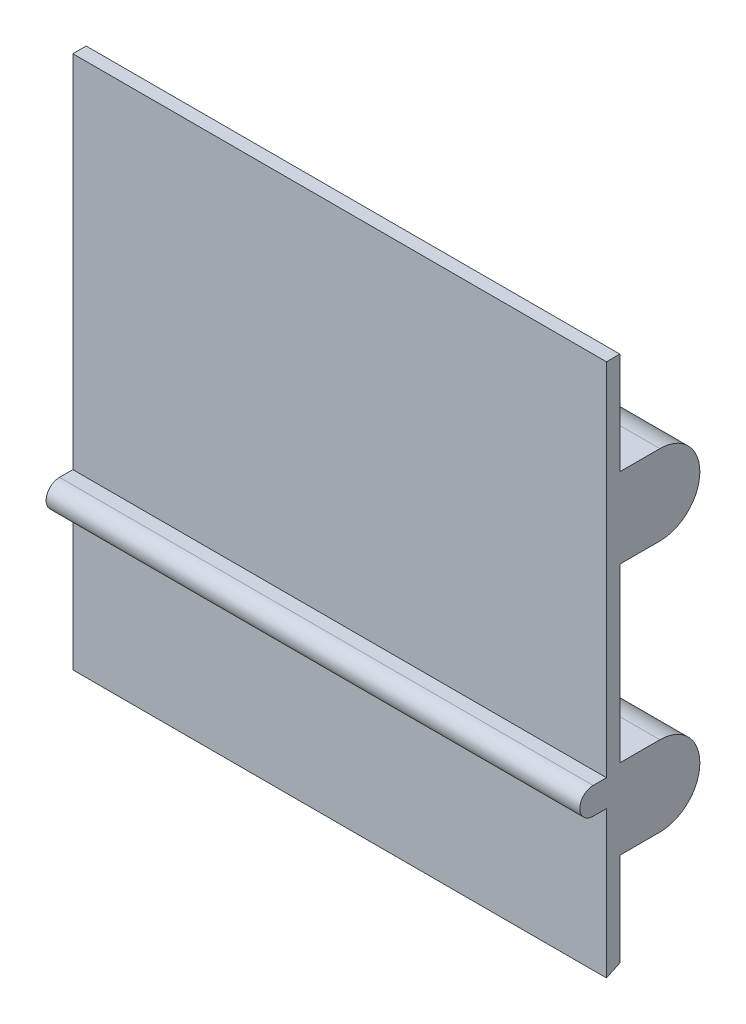
ISO-10303-21;
HEADER;
FILE_DESCRIPTION(('STEP AP214'),'2;1');
FILE_NAME('part.step','',(''),(''),'','','');
FILE_SCHEMA(('AUTOMOTIVE_DESIGN { 1 0 10303 214 1 1 1 1 }'));
ENDSEC;
DATA;
#1=APPLICATION_CONTEXT('core data for automotive mechanical design processes');
#2=APPLICATION_PROTOCOL_DEFINITION('international standard','automotive_design',2000,#1);
#3=PRODUCT_CONTEXT('',#1,'mechanical');
#4=PRODUCT('Part','Part','',(#3));
#5=PRODUCT_RELATED_PRODUCT_CATEGORY('part','',(#4));
#6=PRODUCT_DEFINITION_FORMATION('','',#4);
#7=PRODUCT_DEFINITION_CONTEXT('part definition',#1,'design');
#8=PRODUCT_DEFINITION('design','',#6,#7);
#9=PRODUCT_DEFINITION_SHAPE('','',#8);
#10=(LENGTH_UNIT() NAMED_UNIT(*) SI_UNIT(.MILLI.,.METRE.));
#11=(NAMED_UNIT(*) PLANE_ANGLE_UNIT() SI_UNIT($,.RADIAN.));
#12=(NAMED_UNIT(*) SI_UNIT($,.STERADIAN.) SOLID_ANGLE_UNIT());
#13=UNCERTAINTY_MEASURE_WITH_UNIT(LENGTH_MEASURE(1.E-05),#10,'distance_accuracy_value','');
#14=(GEOMETRIC_REPRESENTATION_CONTEXT(3) GLOBAL_UNCERTAINTY_ASSIGNED_CONTEXT((#13)) GLOBAL_UNIT_ASSIGNED_CONTEXT((#10,
#11,#12)) REPRESENTATION_CONTEXT('',''));
#15=CARTESIAN_POINT('',(0.,0.,0.));
#16=DIRECTION('',(0.,0.,1.));
#17=DIRECTION('',(1.,0.,0.));
#18=AXIS2_PLACEMENT_3D('',#15,#16,#17);
#19=CARTESIAN_POINT('',(0.,0.,3.175));
#20=DIRECTION('',(0.,0.,1.));
#21=DIRECTION('',(1.,0.,0.));
#22=AXIS2_PLACEMENT_3D('',#19,#20,#21);
#23=PLANE('',#22);
#24=DIRECTION('',(0.,-1.,0.));
#25=VECTOR('',#24,1.);
#26=CARTESIAN_POINT('',(-63.5000000000001,63.5,3.175));
#27=LINE('',#26,#25);
#28=CARTESIAN_POINT('',(-63.5000000000001,63.5,3.175));
#29=VERTEX_POINT('',#28);
#30=CARTESIAN_POINT('',(-63.5000000000001,-22.225,3.175));
#31=VERTEX_POINT('',#30);
#32=EDGE_CURVE('E64',#29,#31,#27,.T.);
#33=ORIENTED_EDGE('',*,*,#32,.T.);
#34=DIRECTION('',(1.,0.,0.));
#35=VECTOR('',#34,1.);
#36=CARTESIAN_POINT('',(-72.4802561210693,-22.225,3.175));
#37=LINE('',#36,#35);
#38=CARTESIAN_POINT('',(63.4999999999999,-22.225,3.175));
#39=VERTEX_POINT('',#38);
#40=EDGE_CURVE('E183',#31,#39,#37,.T.);
#41=ORIENTED_EDGE('',*,*,#40,.T.);
#42=DIRECTION('',(0.,1.,0.));
#43=VECTOR('',#42,1.);
#44=CARTESIAN_POINT('',(63.4999999999999,63.5,3.175));
#45=LINE('',#44,#43);
#46=CARTESIAN_POINT('',(63.4999999999999,63.5,3.175));
#47=VERTEX_POINT('',#46);
#48=EDGE_CURVE('E249',#39,#47,#45,.T.);
#49=ORIENTED_EDGE('',*,*,#48,.T.);
#50=DIRECTION('',(-1.,0.,0.));
#51=VECTOR('',#50,1.);
#52=CARTESIAN_POINT('',(-63.5000000000001,63.5,3.175));
#53=LINE('',#52,#51);
#54=EDGE_CURVE('E248',#47,#29,#53,.T.);
#55=ORIENTED_EDGE('',*,*,#54,.T.);
#56=EDGE_LOOP('',(#33,#41,#49,#55));
#57=FACE_BOUND('',#56,.T.);
#58=ADVANCED_FACE('F41',(#57),#23,.T.);
#59=CARTESIAN_POINT('',(0.,0.,0.));
#60=DIRECTION('',(0.,0.,1.));
#61=DIRECTION('',(1.,0.,0.));
#62=AXIS2_PLACEMENT_3D('',#59,#60,#61);
#63=PLANE('',#62);
#64=DIRECTION('',(1.,0.,0.));
#65=VECTOR('',#64,1.);
#66=CARTESIAN_POINT('',(-90.4407683632076,39.2555268146421,0.));
#67=LINE('',#66,#65);
#68=CARTESIAN_POINT('',(-63.5000000000001,39.2555268146421,0.));
#69=VERTEX_POINT('',#68);
#70=CARTESIAN_POINT('',(63.4999999999999,39.2555268146421,0.));
#71=VERTEX_POINT('',#70);
#72=EDGE_CURVE('E210',#69,#71,#67,.T.);
#73=ORIENTED_EDGE('',*,*,#72,.F.);
#74=DIRECTION('',(0.,-1.,0.));
#75=VECTOR('',#74,1.);
#76=CARTESIAN_POINT('',(-63.5000000000001,63.5,0.));
#77=LINE('',#76,#75);
#78=CARTESIAN_POINT('',(-63.5000000000001,63.5,0.));
#79=VERTEX_POINT('',#78);
#80=EDGE_CURVE('E263',#79,#69,#77,.T.);
#81=ORIENTED_EDGE('',*,*,#80,.F.);
#82=DIRECTION('',(-1.,0.,0.));
#83=VECTOR('',#82,1.);
#84=CARTESIAN_POINT('',(-63.5000000000001,63.5,0.));
#85=LINE('',#84,#83);
#86=CARTESIAN_POINT('',(63.4999999999999,63.5,0.));
#87=VERTEX_POINT('',#86);
#88=EDGE_CURVE('E259',#87,#79,#85,.T.);
#89=ORIENTED_EDGE('',*,*,#88,.F.);
#90=DIRECTION('',(0.,1.,0.));
#91=VECTOR('',#90,1.);
#92=CARTESIAN_POINT('',(63.4999999999999,63.5,0.));
#93=LINE('',#92,#91);
#94=EDGE_CURVE('E245',#71,#87,#93,.T.);
#95=ORIENTED_EDGE('',*,*,#94,.F.);
#96=EDGE_LOOP('',(#73,#81,#89,#95));
#97=FACE_BOUND('',#96,.T.);
#98=ADVANCED_FACE('F276',(#97),#63,.F.);
#99=CARTESIAN_POINT('',(-63.5000000000001,20.2055268146421,0.));
#100=VERTEX_POINT('',#99);
#101=CARTESIAN_POINT('',(-63.5000000000001,-20.7444731853579,0.));
#102=VERTEX_POINT('',#101);
#103=EDGE_CURVE('E265',#100,#102,#77,.T.);
#104=ORIENTED_EDGE('',*,*,#103,.F.);
#105=DIRECTION('',(1.,0.,0.));
#106=VECTOR('',#105,1.);
#107=CARTESIAN_POINT('',(-90.4407683632076,20.2055268146421,0.));
#108=LINE('',#107,#106);
#109=CARTESIAN_POINT('',(63.4999999999999,20.2055268146421,0.));
#110=VERTEX_POINT('',#109);
#111=EDGE_CURVE('E208',#100,#110,#108,.T.);
#112=ORIENTED_EDGE('',*,*,#111,.T.);
#113=CARTESIAN_POINT('',(63.4999999999999,-20.7444731853579,0.));
#114=VERTEX_POINT('',#113);
#115=EDGE_CURVE('E260',#114,#110,#93,.T.);
#116=ORIENTED_EDGE('',*,*,#115,.F.);
#117=DIRECTION('',(1.,0.,0.));
#118=VECTOR('',#117,1.);
#119=CARTESIAN_POINT('',(-90.4407683632076,-20.7444731853579,0.));
#120=LINE('',#119,#118);
#121=EDGE_CURVE('E221',#102,#114,#120,.T.);
#122=ORIENTED_EDGE('',*,*,#121,.F.);
#123=EDGE_LOOP('',(#104,#112,#116,#122));
#124=FACE_BOUND('',#123,.T.);
#125=ADVANCED_FACE('F295',(#124),#63,.F.);
#126=CARTESIAN_POINT('',(63.4999999999999,63.5,3.175));
#127=DIRECTION('',(-1.,0.,0.));
#128=DIRECTION('',(0.,0.,1.));
#129=AXIS2_PLACEMENT_3D('',#126,#127,#128);
#130=PLANE('',#129);
#131=CARTESIAN_POINT('',(63.4999999999999,-63.5,3.175));
#132=VERTEX_POINT('',#131);
#133=CARTESIAN_POINT('',(63.4999999999999,-28.575,3.175));
#134=VERTEX_POINT('',#133);
#135=EDGE_CURVE('E246',#132,#134,#45,.T.);
#136=ORIENTED_EDGE('',*,*,#135,.F.);
#137=DIRECTION('',(0.,-0.422618261740701,0.906307787036649));
#138=VECTOR('',#137,1.);
#139=CARTESIAN_POINT('',(63.4999999999999,-63.5,3.175));
#140=LINE('',#139,#138);
#141=CARTESIAN_POINT('',(63.4999999999999,-62.0194731853579,0.));
#142=VERTEX_POINT('',#141);
#143=EDGE_CURVE('E215',#142,#132,#140,.T.);
#144=ORIENTED_EDGE('',*,*,#143,.F.);
#145=CARTESIAN_POINT('',(63.4999999999999,-39.7944731853579,0.));
#146=VERTEX_POINT('',#145);
#147=EDGE_CURVE('E256',#142,#146,#93,.T.);
#148=ORIENTED_EDGE('',*,*,#147,.T.);
#149=DIRECTION('',(0.,0.,-1.));
#150=VECTOR('',#149,1.);
#151=CARTESIAN_POINT('',(63.4999999999999,-39.7944731853579,0.));
#152=LINE('',#151,#150);
#153=CARTESIAN_POINT('',(63.4999999999999,-39.7944731853579,-9.525));
#154=VERTEX_POINT('',#153);
#155=EDGE_CURVE('E220',#146,#154,#152,.T.);
#156=ORIENTED_EDGE('',*,*,#155,.T.);
#157=CARTESIAN_POINT('',(63.4999999999999,-30.2694731853579,-9.525));
#158=DIRECTION('',(1.,0.,0.));
#159=DIRECTION('',(0.,0.,-1.));
#160=AXIS2_PLACEMENT_3D('',#157,#158,#159);
#161=CIRCLE('',#160,9.52500000000001);
#162=CARTESIAN_POINT('',(63.4999999999999,-20.7444731853579,-9.525));
#163=VERTEX_POINT('',#162);
#164=EDGE_CURVE('E200',#154,#163,#161,.T.);
#165=ORIENTED_EDGE('',*,*,#164,.T.);
#166=DIRECTION('',(0.,0.,1.));
#167=VECTOR('',#166,1.);
#168=CARTESIAN_POINT('',(63.4999999999999,-20.7444731853579,-9.525));
#169=LINE('',#168,#167);
#170=EDGE_CURVE('E231',#163,#114,#169,.T.);
#171=ORIENTED_EDGE('',*,*,#170,.T.);
#172=ORIENTED_EDGE('',*,*,#115,.T.);
#173=DIRECTION('',(0.,0.,-1.));
#174=VECTOR('',#173,1.);
#175=CARTESIAN_POINT('',(63.4999999999999,20.2055268146421,0.));
#176=LINE('',#175,#174);
#177=CARTESIAN_POINT('',(63.4999999999999,20.2055268146421,-9.525));
#178=VERTEX_POINT('',#177);
#179=EDGE_CURVE('E203',#110,#178,#176,.T.);
#180=ORIENTED_EDGE('',*,*,#179,.T.);
#181=CARTESIAN_POINT('',(63.4999999999999,29.7305268146421,-9.525));
#182=DIRECTION('',(1.,0.,0.));
#183=DIRECTION('',(0.,0.,-1.));
#184=AXIS2_PLACEMENT_3D('',#181,#182,#183);
#185=CIRCLE('',#184,9.525);
#186=CARTESIAN_POINT('',(63.4999999999999,39.2555268146421,-9.525));
#187=VERTEX_POINT('',#186);
#188=EDGE_CURVE('E196',#178,#187,#185,.T.);
#189=ORIENTED_EDGE('',*,*,#188,.T.);
#190=DIRECTION('',(0.,0.,1.));
#191=VECTOR('',#190,1.);
#192=CARTESIAN_POINT('',(63.4999999999999,39.2555268146421,-9.525));
#193=LINE('',#192,#191);
#194=EDGE_CURVE('E199',#187,#71,#193,.T.);
#195=ORIENTED_EDGE('',*,*,#194,.T.);
#196=ORIENTED_EDGE('',*,*,#94,.T.);
#197=DIRECTION('',(0.,0.,-1.));
#198=VECTOR('',#197,1.);
#199=CARTESIAN_POINT('',(63.4999999999999,63.5,3.175));
#200=LINE('',#199,#198);
#201=EDGE_CURVE('E11',#47,#87,#200,.T.);
#202=ORIENTED_EDGE('',*,*,#201,.F.);
#203=ORIENTED_EDGE('',*,*,#48,.F.);
#204=DIRECTION('',(0.,0.,1.));
#205=VECTOR('',#204,1.);
#206=CARTESIAN_POINT('',(63.4999999999999,-22.225,6.35));
#207=LINE('',#206,#205);
#208=CARTESIAN_POINT('',(63.4999999999999,-22.225,6.35));
#209=VERTEX_POINT('',#208);
#210=EDGE_CURVE('E165',#39,#209,#207,.T.);
#211=ORIENTED_EDGE('',*,*,#210,.T.);
#212=CARTESIAN_POINT('',(63.4999999999999,-25.4,6.35));
#213=DIRECTION('',(1.,0.,0.));
#214=DIRECTION('',(0.,0.,-1.));
#215=AXIS2_PLACEMENT_3D('',#212,#213,#214);
#216=CIRCLE('',#215,3.175);
#217=CARTESIAN_POINT('',(63.4999999999999,-28.575,6.35));
#218=VERTEX_POINT('',#217);
#219=EDGE_CURVE('E160',#209,#218,#216,.T.);
#220=ORIENTED_EDGE('',*,*,#219,.T.);
#221=DIRECTION('',(0.,0.,-1.));
#222=VECTOR('',#221,1.);
#223=CARTESIAN_POINT('',(63.4999999999999,-28.575,6.35));
#224=LINE('',#223,#222);
#225=EDGE_CURVE('E168',#218,#134,#224,.T.);
#226=ORIENTED_EDGE('',*,*,#225,.T.);
#227=EDGE_LOOP('',(#136,#144,#148,#156,#165,#171,#172,#180,#189,#195,#196,#202,#203,#211,#220,#226));
#228=FACE_BOUND('',#227,.T.);
#229=ADVANCED_FACE('F43',(#228),#130,.F.);
#230=CARTESIAN_POINT('',(-63.5000000000001,63.5,3.175));
#231=DIRECTION('',(0.,-1.,0.));
#232=DIRECTION('',(0.,0.,-1.));
#233=AXIS2_PLACEMENT_3D('',#230,#231,#232);
#234=PLANE('',#233);
#235=ORIENTED_EDGE('',*,*,#88,.T.);
#236=DIRECTION('',(0.,0.,-1.));
#237=VECTOR('',#236,1.);
#238=CARTESIAN_POINT('',(-63.5000000000001,63.5,3.175));
#239=LINE('',#238,#237);
#240=EDGE_CURVE('E49',#29,#79,#239,.T.);
#241=ORIENTED_EDGE('',*,*,#240,.F.);
#242=ORIENTED_EDGE('',*,*,#54,.F.);
#243=ORIENTED_EDGE('',*,*,#201,.T.);
#244=EDGE_LOOP('',(#235,#241,#242,#243));
#245=FACE_BOUND('',#244,.T.);
#246=ADVANCED_FACE('F345',(#245),#234,.F.);
#247=CARTESIAN_POINT('',(-63.5000000000001,63.5,3.175));
#248=DIRECTION('',(1.,0.,0.));
#249=DIRECTION('',(0.,0.,-1.));
#250=AXIS2_PLACEMENT_3D('',#247,#248,#249);
#251=PLANE('',#250);
#252=ORIENTED_EDGE('',*,*,#80,.T.);
#253=DIRECTION('',(0.,0.,-1.));
#254=VECTOR('',#253,1.);
#255=CARTESIAN_POINT('',(-63.5000000000001,39.2555268146421,-9.525));
#256=LINE('',#255,#254);
#257=CARTESIAN_POINT('',(-63.5000000000001,39.2555268146421,-9.525));
#258=VERTEX_POINT('',#257);
#259=EDGE_CURVE('E195',#69,#258,#256,.T.);
#260=ORIENTED_EDGE('',*,*,#259,.T.);
#261=CARTESIAN_POINT('',(-63.5000000000001,29.7305268146421,-9.525));
#262=DIRECTION('',(1.,0.,0.));
#263=DIRECTION('',(0.,0.,-1.));
#264=AXIS2_PLACEMENT_3D('',#261,#262,#263);
#265=CIRCLE('',#264,9.525);
#266=CARTESIAN_POINT('',(-63.5000000000001,20.2055268146421,-9.525));
#267=VERTEX_POINT('',#266);
#268=EDGE_CURVE('E192',#258,#267,#265,.F.);
#269=ORIENTED_EDGE('',*,*,#268,.T.);
#270=DIRECTION('',(0.,0.,1.));
#271=VECTOR('',#270,1.);
#272=CARTESIAN_POINT('',(-63.5000000000001,20.2055268146421,0.));
#273=LINE('',#272,#271);
#274=EDGE_CURVE('E189',#267,#100,#273,.T.);
#275=ORIENTED_EDGE('',*,*,#274,.T.);
#276=ORIENTED_EDGE('',*,*,#103,.T.);
#277=DIRECTION('',(0.,0.,-1.));
#278=VECTOR('',#277,1.);
#279=CARTESIAN_POINT('',(-63.5000000000001,-20.7444731853579,-9.525));
#280=LINE('',#279,#278);
#281=CARTESIAN_POINT('',(-63.5000000000001,-20.7444731853579,-9.525));
#282=VERTEX_POINT('',#281);
#283=EDGE_CURVE('E188',#102,#282,#280,.T.);
#284=ORIENTED_EDGE('',*,*,#283,.T.);
#285=CARTESIAN_POINT('',(-63.5000000000001,-30.2694731853579,-9.525));
#286=DIRECTION('',(1.,0.,0.));
#287=DIRECTION('',(0.,0.,-1.));
#288=AXIS2_PLACEMENT_3D('',#285,#286,#287);
#289=CIRCLE('',#288,9.52500000000001);
#290=CARTESIAN_POINT('',(-63.5000000000001,-39.7944731853579,-9.525));
#291=VERTEX_POINT('',#290);
#292=EDGE_CURVE('E217',#282,#291,#289,.F.);
#293=ORIENTED_EDGE('',*,*,#292,.T.);
#294=DIRECTION('',(0.,0.,1.));
#295=VECTOR('',#294,1.);
#296=CARTESIAN_POINT('',(-63.5000000000001,-39.7944731853579,0.));
#297=LINE('',#296,#295);
#298=CARTESIAN_POINT('',(-63.5000000000001,-39.7944731853579,0.));
#299=VERTEX_POINT('',#298);
#300=EDGE_CURVE('E228',#291,#299,#297,.T.);
#301=ORIENTED_EDGE('',*,*,#300,.T.);
#302=CARTESIAN_POINT('',(-63.5000000000001,-62.0194731853579,0.));
#303=VERTEX_POINT('',#302);
#304=EDGE_CURVE('E262',#299,#303,#77,.T.);
#305=ORIENTED_EDGE('',*,*,#304,.T.);
#306=DIRECTION('',(0.,-0.422618261740701,0.906307787036649));
#307=VECTOR('',#306,1.);
#308=CARTESIAN_POINT('',(-63.5000000000001,-63.5,3.175));
#309=LINE('',#308,#307);
#310=CARTESIAN_POINT('',(-63.5000000000001,-63.5,3.175));
#311=VERTEX_POINT('',#310);
#312=EDGE_CURVE('E239',#303,#311,#309,.T.);
#313=ORIENTED_EDGE('',*,*,#312,.T.);
#314=CARTESIAN_POINT('',(-63.5000000000001,-28.575,3.175));
#315=VERTEX_POINT('',#314);
#316=EDGE_CURVE('E251',#315,#311,#27,.T.);
#317=ORIENTED_EDGE('',*,*,#316,.F.);
#318=DIRECTION('',(0.,0.,1.));
#319=VECTOR('',#318,1.);
#320=CARTESIAN_POINT('',(-63.5000000000001,-28.575,6.35));
#321=LINE('',#320,#319);
#322=CARTESIAN_POINT('',(-63.5000000000001,-28.575,6.35));
#323=VERTEX_POINT('',#322);
#324=EDGE_CURVE('E186',#315,#323,#321,.T.);
#325=ORIENTED_EDGE('',*,*,#324,.T.);
#326=CARTESIAN_POINT('',(-63.5000000000001,-25.4,6.35));
#327=DIRECTION('',(1.,0.,0.));
#328=DIRECTION('',(0.,0.,-1.));
#329=AXIS2_PLACEMENT_3D('',#326,#327,#328);
#330=CIRCLE('',#329,3.175);
#331=CARTESIAN_POINT('',(-63.5000000000001,-22.225,6.35));
#332=VERTEX_POINT('',#331);
#333=EDGE_CURVE('E162',#323,#332,#330,.F.);
#334=ORIENTED_EDGE('',*,*,#333,.T.);
#335=DIRECTION('',(0.,0.,-1.));
#336=VECTOR('',#335,1.);
#337=CARTESIAN_POINT('',(-63.5000000000001,-22.225,6.35));
#338=LINE('',#337,#336);
#339=EDGE_CURVE('E182',#332,#31,#338,.T.);
#340=ORIENTED_EDGE('',*,*,#339,.T.);
#341=ORIENTED_EDGE('',*,*,#32,.F.);
#342=ORIENTED_EDGE('',*,*,#240,.T.);
#343=EDGE_LOOP('',(#252,#260,#269,#275,#276,#284,#293,#301,#305,#313,#317,#325,#334,#340,#341,#342));
#344=FACE_BOUND('',#343,.T.);
#345=ADVANCED_FACE('F270',(#344),#251,.F.);
#346=DIRECTION('',(1.,0.,0.));
#347=VECTOR('',#346,1.);
#348=CARTESIAN_POINT('',(-72.4802561210693,-28.575,3.175));
#349=LINE('',#348,#347);
#350=EDGE_CURVE('E56',#315,#134,#349,.T.);
#351=ORIENTED_EDGE('',*,*,#350,.F.);
#352=ORIENTED_EDGE('',*,*,#316,.T.);
#353=DIRECTION('',(1.,0.,0.));
#354=VECTOR('',#353,1.);
#355=CARTESIAN_POINT('',(-63.5000000000001,-63.5,3.175));
#356=LINE('',#355,#354);
#357=EDGE_CURVE('E253',#311,#132,#356,.T.);
#358=ORIENTED_EDGE('',*,*,#357,.T.);
#359=ORIENTED_EDGE('',*,*,#135,.T.);
#360=EDGE_LOOP('',(#351,#352,#358,#359));
#361=FACE_BOUND('',#360,.T.);
#362=ADVANCED_FACE('F333',(#361),#23,.T.);
#363=ORIENTED_EDGE('',*,*,#304,.F.);
#364=DIRECTION('',(1.,0.,0.));
#365=VECTOR('',#364,1.);
#366=CARTESIAN_POINT('',(-90.4407683632076,-39.7944731853579,0.));
#367=LINE('',#366,#365);
#368=EDGE_CURVE('E224',#299,#146,#367,.T.);
#369=ORIENTED_EDGE('',*,*,#368,.T.);
#370=ORIENTED_EDGE('',*,*,#147,.F.);
#371=DIRECTION('',(1.,0.,0.));
#372=VECTOR('',#371,1.);
#373=CARTESIAN_POINT('',(-63.5000000000001,-62.0194731853579,0.));
#374=LINE('',#373,#372);
#375=EDGE_CURVE('E242',#303,#142,#374,.T.);
#376=ORIENTED_EDGE('',*,*,#375,.F.);
#377=EDGE_LOOP('',(#363,#369,#370,#376));
#378=FACE_BOUND('',#377,.T.);
#379=ADVANCED_FACE('F313',(#378),#63,.F.);
#380=CARTESIAN_POINT('',(-63.5000000000001,-63.5,3.175));
#381=DIRECTION('',(0.,0.906307787036649,0.422618261740701));
#382=DIRECTION('',(0.,-0.422618261740701,0.906307787036649));
#383=AXIS2_PLACEMENT_3D('',#380,#381,#382);
#384=PLANE('',#383);
#385=ORIENTED_EDGE('',*,*,#143,.T.);
#386=ORIENTED_EDGE('',*,*,#357,.F.);
#387=ORIENTED_EDGE('',*,*,#312,.F.);
#388=ORIENTED_EDGE('',*,*,#375,.T.);
#389=EDGE_LOOP('',(#385,#386,#387,#388));
#390=FACE_BOUND('',#389,.T.);
#391=ADVANCED_FACE('F310',(#390),#384,.F.);
#392=CARTESIAN_POINT('',(-90.4407683632076,-30.2694731853579,-9.525));
#393=DIRECTION('',(1.,0.,0.));
#394=DIRECTION('',(0.,0.,-1.));
#395=AXIS2_PLACEMENT_3D('',#392,#393,#394);
#396=CYLINDRICAL_SURFACE('',#395,9.52500000000001);
#397=ORIENTED_EDGE('',*,*,#292,.F.);
#398=DIRECTION('',(1.,0.,0.));
#399=VECTOR('',#398,1.);
#400=CARTESIAN_POINT('',(-90.4407683632076,-20.7444731853579,-9.525));
#401=LINE('',#400,#399);
#402=EDGE_CURVE('E218',#282,#163,#401,.T.);
#403=ORIENTED_EDGE('',*,*,#402,.T.);
#404=ORIENTED_EDGE('',*,*,#164,.F.);
#405=DIRECTION('',(1.,0.,0.));
#406=VECTOR('',#405,1.);
#407=CARTESIAN_POINT('',(-90.4407683632076,-39.7944731853579,-9.525));
#408=LINE('',#407,#406);
#409=EDGE_CURVE('E226',#291,#154,#408,.T.);
#410=ORIENTED_EDGE('',*,*,#409,.F.);
#411=EDGE_LOOP('',(#397,#403,#404,#410));
#412=FACE_BOUND('',#411,.T.);
#413=ADVANCED_FACE('F319',(#412),#396,.T.);
#414=CARTESIAN_POINT('',(-90.4407683632076,-39.7944731853579,0.));
#415=DIRECTION('',(0.,-1.,0.));
#416=DIRECTION('',(0.,0.,-1.));
#417=AXIS2_PLACEMENT_3D('',#414,#415,#416);
#418=PLANE('',#417);
#419=ORIENTED_EDGE('',*,*,#300,.F.);
#420=ORIENTED_EDGE('',*,*,#409,.T.);
#421=ORIENTED_EDGE('',*,*,#155,.F.);
#422=ORIENTED_EDGE('',*,*,#368,.F.);
#423=EDGE_LOOP('',(#419,#420,#421,#422));
#424=FACE_BOUND('',#423,.T.);
#425=ADVANCED_FACE('F316',(#424),#418,.T.);
#426=CARTESIAN_POINT('',(-90.4407683632076,-20.7444731853579,-9.525));
#427=DIRECTION('',(0.,1.,0.));
#428=DIRECTION('',(0.,0.,1.));
#429=AXIS2_PLACEMENT_3D('',#426,#427,#428);
#430=PLANE('',#429);
#431=ORIENTED_EDGE('',*,*,#283,.F.);
#432=ORIENTED_EDGE('',*,*,#121,.T.);
#433=ORIENTED_EDGE('',*,*,#170,.F.);
#434=ORIENTED_EDGE('',*,*,#402,.F.);
#435=EDGE_LOOP('',(#431,#432,#433,#434));
#436=FACE_BOUND('',#435,.T.);
#437=ADVANCED_FACE('F301',(#436),#430,.T.);
#438=CARTESIAN_POINT('',(-90.4407683632076,29.7305268146421,-9.525));
#439=DIRECTION('',(1.,0.,0.));
#440=DIRECTION('',(0.,0.,-1.));
#441=AXIS2_PLACEMENT_3D('',#438,#439,#440);
#442=CYLINDRICAL_SURFACE('',#441,9.525);
#443=ORIENTED_EDGE('',*,*,#268,.F.);
#444=DIRECTION('',(1.,0.,0.));
#445=VECTOR('',#444,1.);
#446=CARTESIAN_POINT('',(-90.4407683632076,39.2555268146421,-9.525));
#447=LINE('',#446,#445);
#448=EDGE_CURVE('E206',#258,#187,#447,.T.);
#449=ORIENTED_EDGE('',*,*,#448,.T.);
#450=ORIENTED_EDGE('',*,*,#188,.F.);
#451=DIRECTION('',(1.,0.,0.));
#452=VECTOR('',#451,1.);
#453=CARTESIAN_POINT('',(-90.4407683632076,20.2055268146421,-9.525));
#454=LINE('',#453,#452);
#455=EDGE_CURVE('E193',#267,#178,#454,.T.);
#456=ORIENTED_EDGE('',*,*,#455,.F.);
#457=EDGE_LOOP('',(#443,#449,#450,#456));
#458=FACE_BOUND('',#457,.T.);
#459=ADVANCED_FACE('F288',(#458),#442,.T.);
#460=CARTESIAN_POINT('',(-90.4407683632076,20.2055268146421,0.));
#461=DIRECTION('',(0.,-1.,0.));
#462=DIRECTION('',(0.,0.,-1.));
#463=AXIS2_PLACEMENT_3D('',#460,#461,#462);
#464=PLANE('',#463);
#465=ORIENTED_EDGE('',*,*,#274,.F.);
#466=ORIENTED_EDGE('',*,*,#455,.T.);
#467=ORIENTED_EDGE('',*,*,#179,.F.);
#468=ORIENTED_EDGE('',*,*,#111,.F.);
#469=EDGE_LOOP('',(#465,#466,#467,#468));
#470=FACE_BOUND('',#469,.T.);
#471=ADVANCED_FACE('F293',(#470),#464,.T.);
#472=CARTESIAN_POINT('',(-90.4407683632076,39.2555268146421,-9.525));
#473=DIRECTION('',(0.,1.,0.));
#474=DIRECTION('',(0.,0.,1.));
#475=AXIS2_PLACEMENT_3D('',#472,#473,#474);
#476=PLANE('',#475);
#477=ORIENTED_EDGE('',*,*,#259,.F.);
#478=ORIENTED_EDGE('',*,*,#72,.T.);
#479=ORIENTED_EDGE('',*,*,#194,.F.);
#480=ORIENTED_EDGE('',*,*,#448,.F.);
#481=EDGE_LOOP('',(#477,#478,#479,#480));
#482=FACE_BOUND('',#481,.T.);
#483=ADVANCED_FACE('F279',(#482),#476,.T.);
#484=CARTESIAN_POINT('',(-72.4802561210693,-25.4,6.35));
#485=DIRECTION('',(1.,0.,0.));
#486=DIRECTION('',(0.,0.,-1.));
#487=AXIS2_PLACEMENT_3D('',#484,#485,#486);
#488=CYLINDRICAL_SURFACE('',#487,3.175);
#489=ORIENTED_EDGE('',*,*,#333,.F.);
#490=DIRECTION('',(1.,0.,0.));
#491=VECTOR('',#490,1.);
#492=CARTESIAN_POINT('',(-72.4802561210693,-28.575,6.35));
#493=LINE('',#492,#491);
#494=EDGE_CURVE('E155',#323,#218,#493,.T.);
#495=ORIENTED_EDGE('',*,*,#494,.T.);
#496=ORIENTED_EDGE('',*,*,#219,.F.);
#497=DIRECTION('',(1.,0.,0.));
#498=VECTOR('',#497,1.);
#499=CARTESIAN_POINT('',(-72.4802561210693,-22.225,6.35));
#500=LINE('',#499,#498);
#501=EDGE_CURVE('E180',#332,#209,#500,.T.);
#502=ORIENTED_EDGE('',*,*,#501,.F.);
#503=EDGE_LOOP('',(#489,#495,#496,#502));
#504=FACE_BOUND('',#503,.T.);
#505=ADVANCED_FACE('F157',(#504),#488,.T.);
#506=CARTESIAN_POINT('',(-72.4802561210693,-22.225,6.35));
#507=DIRECTION('',(0.,1.,0.));
#508=DIRECTION('',(0.,0.,1.));
#509=AXIS2_PLACEMENT_3D('',#506,#507,#508);
#510=PLANE('',#509);
#511=ORIENTED_EDGE('',*,*,#339,.F.);
#512=ORIENTED_EDGE('',*,*,#501,.T.);
#513=ORIENTED_EDGE('',*,*,#210,.F.);
#514=ORIENTED_EDGE('',*,*,#40,.F.);
#515=EDGE_LOOP('',(#511,#512,#513,#514));
#516=FACE_BOUND('',#515,.T.);
#517=ADVANCED_FACE('F355',(#516),#510,.T.);
#518=CARTESIAN_POINT('',(-72.4802561210693,-28.575,6.35));
#519=DIRECTION('',(0.,-1.,0.));
#520=DIRECTION('',(0.,0.,-1.));
#521=AXIS2_PLACEMENT_3D('',#518,#519,#520);
#522=PLANE('',#521);
#523=ORIENTED_EDGE('',*,*,#324,.F.);
#524=ORIENTED_EDGE('',*,*,#350,.T.);
#525=ORIENTED_EDGE('',*,*,#225,.F.);
#526=ORIENTED_EDGE('',*,*,#494,.F.);
#527=EDGE_LOOP('',(#523,#524,#525,#526));
#528=FACE_BOUND('',#527,.T.);
#529=ADVANCED_FACE('F169',(#528),#522,.T.);
#530=CLOSED_SHELL('',(#58,#98,#125,#229,#246,#345,#362,#379,#391,#413,#425,#437,#459,#471,#483,
#505,#517,#529));
#531=MANIFOLD_SOLID_BREP('B2',#530);
#532=ADVANCED_BREP_SHAPE_REPRESENTATION('',(#18,#531),#14);
#533=SHAPE_DEFINITION_REPRESENTATION(#9,#532);
ENDSEC;
END-ISO-10303-21;
